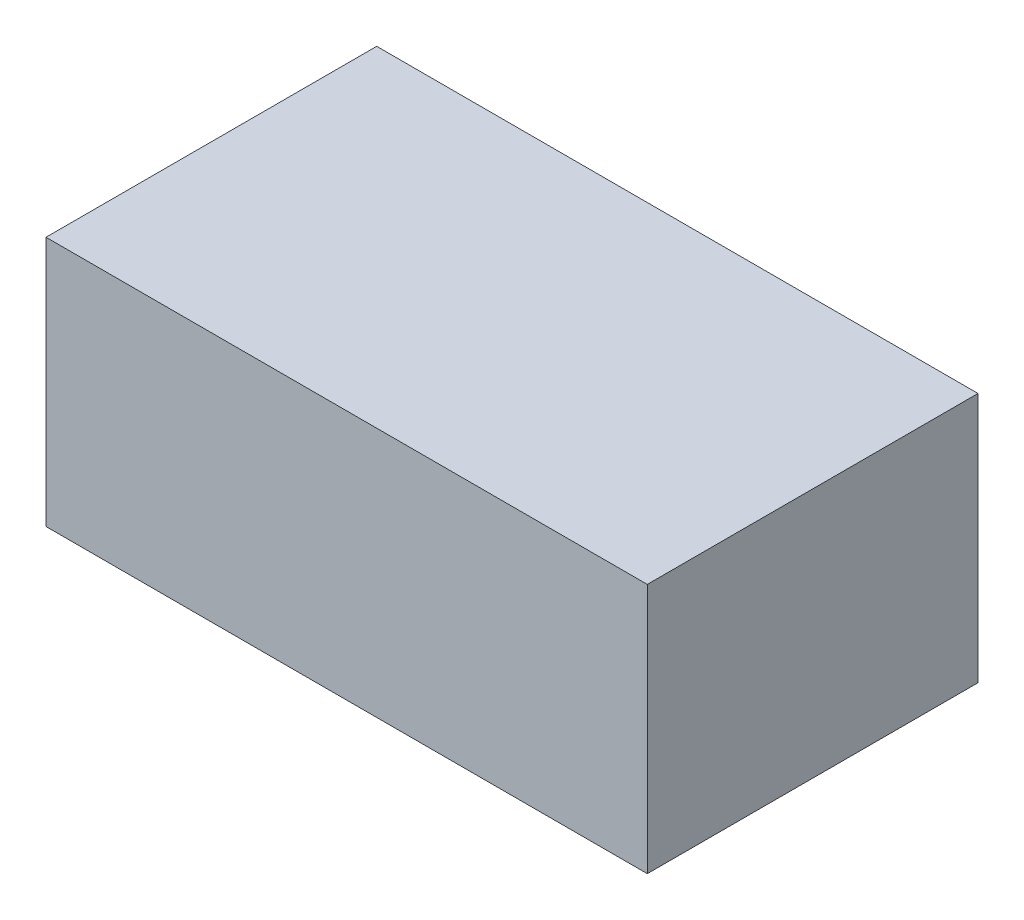
ISO-10303-21;
HEADER;
FILE_DESCRIPTION(('STEP AP214'),'2;1');
FILE_NAME('part.step','',(''),(''),'','','');
FILE_SCHEMA(('AUTOMOTIVE_DESIGN { 1 0 10303 214 1 1 1 1 }'));
ENDSEC;
DATA;
#1=APPLICATION_CONTEXT('core data for automotive mechanical design processes');
#2=APPLICATION_PROTOCOL_DEFINITION('international standard','automotive_design',2000,#1);
#3=PRODUCT_CONTEXT('',#1,'mechanical');
#4=PRODUCT('Part','Part','',(#3));
#5=PRODUCT_RELATED_PRODUCT_CATEGORY('part','',(#4));
#6=PRODUCT_DEFINITION_FORMATION('','',#4);
#7=PRODUCT_DEFINITION_CONTEXT('part definition',#1,'design');
#8=PRODUCT_DEFINITION('design','',#6,#7);
#9=PRODUCT_DEFINITION_SHAPE('','',#8);
#10=(LENGTH_UNIT() NAMED_UNIT(*) SI_UNIT(.MILLI.,.METRE.));
#11=(NAMED_UNIT(*) PLANE_ANGLE_UNIT() SI_UNIT($,.RADIAN.));
#12=(NAMED_UNIT(*) SI_UNIT($,.STERADIAN.) SOLID_ANGLE_UNIT());
#13=UNCERTAINTY_MEASURE_WITH_UNIT(LENGTH_MEASURE(1.E-05),#10,'distance_accuracy_value','');
#14=(GEOMETRIC_REPRESENTATION_CONTEXT(3) GLOBAL_UNCERTAINTY_ASSIGNED_CONTEXT((#13)) GLOBAL_UNIT_ASSIGNED_CONTEXT((#10,
#11,#12)) REPRESENTATION_CONTEXT('',''));
#15=CARTESIAN_POINT('',(0.,0.,0.));
#16=DIRECTION('',(0.,0.,1.));
#17=DIRECTION('',(1.,0.,0.));
#18=AXIS2_PLACEMENT_3D('',#15,#16,#17);
#19=CARTESIAN_POINT('',(-0.2999994,-0.12499848,0.32999934));
#20=DIRECTION('',(0.,0.,-1.));
#21=DIRECTION('',(0.,-1.,0.));
#22=AXIS2_PLACEMENT_3D('',#19,#20,#21);
#23=PLANE('',#22);
#24=DIRECTION('',(1.,0.,0.));
#25=VECTOR('',#24,1.);
#26=CARTESIAN_POINT('',(-0.2999994,-0.12499848,0.32999934));
#27=LINE('',#26,#25);
#28=CARTESIAN_POINT('',(-0.2999994,-0.12499848,0.32999934));
#29=VERTEX_POINT('',#28);
#30=CARTESIAN_POINT('',(0.2999994,-0.12499848,0.32999934));
#31=VERTEX_POINT('',#30);
#32=EDGE_CURVE('E89',#29,#31,#27,.T.);
#33=ORIENTED_EDGE('',*,*,#32,.T.);
#34=DIRECTION('',(0.,1.,0.));
#35=VECTOR('',#34,1.);
#36=CARTESIAN_POINT('',(0.2999994,-0.12499848,0.32999934));
#37=LINE('',#36,#35);
#38=CARTESIAN_POINT('',(0.2999994,0.12500102,0.32999934));
#39=VERTEX_POINT('',#38);
#40=EDGE_CURVE('E60',#31,#39,#37,.T.);
#41=ORIENTED_EDGE('',*,*,#40,.T.);
#42=DIRECTION('',(-1.,0.,0.));
#43=VECTOR('',#42,1.);
#44=CARTESIAN_POINT('',(0.2999994,0.12500102,0.32999934));
#45=LINE('',#44,#43);
#46=CARTESIAN_POINT('',(-0.2999994,0.12500102,0.32999934));
#47=VERTEX_POINT('',#46);
#48=EDGE_CURVE('E81',#39,#47,#45,.T.);
#49=ORIENTED_EDGE('',*,*,#48,.T.);
#50=DIRECTION('',(0.,-1.,0.));
#51=VECTOR('',#50,1.);
#52=CARTESIAN_POINT('',(-0.2999994,0.12500102,0.32999934));
#53=LINE('',#52,#51);
#54=EDGE_CURVE('E11',#47,#29,#53,.T.);
#55=ORIENTED_EDGE('',*,*,#54,.T.);
#56=EDGE_LOOP('',(#33,#41,#49,#55));
#57=FACE_BOUND('',#56,.T.);
#58=ADVANCED_FACE('F16',(#57),#23,.F.);
#59=CARTESIAN_POINT('',(-0.2999994,-0.12499848,0.));
#60=DIRECTION('',(0.,0.,-1.));
#61=DIRECTION('',(0.,-1.,0.));
#62=AXIS2_PLACEMENT_3D('',#59,#60,#61);
#63=PLANE('',#62);
#64=DIRECTION('',(0.,-1.,0.));
#65=VECTOR('',#64,1.);
#66=CARTESIAN_POINT('',(-0.2999994,0.12500102,0.));
#67=LINE('',#66,#65);
#68=CARTESIAN_POINT('',(-0.2999994,0.12500102,0.));
#69=VERTEX_POINT('',#68);
#70=CARTESIAN_POINT('',(-0.2999994,-0.12499848,0.));
#71=VERTEX_POINT('',#70);
#72=EDGE_CURVE('E27',#69,#71,#67,.T.);
#73=ORIENTED_EDGE('',*,*,#72,.F.);
#74=DIRECTION('',(-1.,0.,0.));
#75=VECTOR('',#74,1.);
#76=CARTESIAN_POINT('',(0.2999994,0.12500102,0.));
#77=LINE('',#76,#75);
#78=CARTESIAN_POINT('',(0.2999994,0.12500102,0.));
#79=VERTEX_POINT('',#78);
#80=EDGE_CURVE('E20',#79,#69,#77,.T.);
#81=ORIENTED_EDGE('',*,*,#80,.F.);
#82=DIRECTION('',(0.,1.,0.));
#83=VECTOR('',#82,1.);
#84=CARTESIAN_POINT('',(0.2999994,-0.12499848,0.));
#85=LINE('',#84,#83);
#86=CARTESIAN_POINT('',(0.2999994,-0.12499848,0.));
#87=VERTEX_POINT('',#86);
#88=EDGE_CURVE('E70',#87,#79,#85,.T.);
#89=ORIENTED_EDGE('',*,*,#88,.F.);
#90=DIRECTION('',(1.,0.,0.));
#91=VECTOR('',#90,1.);
#92=CARTESIAN_POINT('',(-0.2999994,-0.12499848,0.));
#93=LINE('',#92,#91);
#94=EDGE_CURVE('E113',#71,#87,#93,.T.);
#95=ORIENTED_EDGE('',*,*,#94,.F.);
#96=EDGE_LOOP('',(#73,#81,#89,#95));
#97=FACE_BOUND('',#96,.T.);
#98=ADVANCED_FACE('F115',(#97),#63,.T.);
#99=CARTESIAN_POINT('',(-0.2999994,0.12500102,0.));
#100=DIRECTION('',(1.,0.,0.));
#101=DIRECTION('',(0.,1.,0.));
#102=AXIS2_PLACEMENT_3D('',#99,#100,#101);
#103=PLANE('',#102);
#104=ORIENTED_EDGE('',*,*,#72,.T.);
#105=DIRECTION('',(0.,0.,1.));
#106=VECTOR('',#105,1.);
#107=CARTESIAN_POINT('',(-0.2999994,-0.12499848,0.));
#108=LINE('',#107,#106);
#109=EDGE_CURVE('E99',#71,#29,#108,.T.);
#110=ORIENTED_EDGE('',*,*,#109,.T.);
#111=ORIENTED_EDGE('',*,*,#54,.F.);
#112=DIRECTION('',(0.,0.,1.));
#113=VECTOR('',#112,1.);
#114=CARTESIAN_POINT('',(-0.2999994,0.12500102,0.));
#115=LINE('',#114,#113);
#116=EDGE_CURVE('E84',#69,#47,#115,.T.);
#117=ORIENTED_EDGE('',*,*,#116,.F.);
#118=EDGE_LOOP('',(#104,#110,#111,#117));
#119=FACE_BOUND('',#118,.T.);
#120=ADVANCED_FACE('F110',(#119),#103,.F.);
#121=CARTESIAN_POINT('',(0.2999994,0.12500102,0.));
#122=DIRECTION('',(0.,-1.,0.));
#123=DIRECTION('',(0.,0.,-1.));
#124=AXIS2_PLACEMENT_3D('',#121,#122,#123);
#125=PLANE('',#124);
#126=ORIENTED_EDGE('',*,*,#80,.T.);
#127=ORIENTED_EDGE('',*,*,#116,.T.);
#128=ORIENTED_EDGE('',*,*,#48,.F.);
#129=DIRECTION('',(0.,0.,1.));
#130=VECTOR('',#129,1.);
#131=CARTESIAN_POINT('',(0.2999994,0.12500102,0.));
#132=LINE('',#131,#130);
#133=EDGE_CURVE('E83',#79,#39,#132,.T.);
#134=ORIENTED_EDGE('',*,*,#133,.F.);
#135=EDGE_LOOP('',(#126,#127,#128,#134));
#136=FACE_BOUND('',#135,.T.);
#137=ADVANCED_FACE('F82',(#136),#125,.F.);
#138=CARTESIAN_POINT('',(0.2999994,-0.12499848,0.));
#139=DIRECTION('',(-1.,0.,0.));
#140=DIRECTION('',(0.,0.,1.));
#141=AXIS2_PLACEMENT_3D('',#138,#139,#140);
#142=PLANE('',#141);
#143=ORIENTED_EDGE('',*,*,#88,.T.);
#144=ORIENTED_EDGE('',*,*,#133,.T.);
#145=ORIENTED_EDGE('',*,*,#40,.F.);
#146=DIRECTION('',(0.,0.,1.));
#147=VECTOR('',#146,1.);
#148=CARTESIAN_POINT('',(0.2999994,-0.12499848,0.));
#149=LINE('',#148,#147);
#150=EDGE_CURVE('E105',#87,#31,#149,.T.);
#151=ORIENTED_EDGE('',*,*,#150,.F.);
#152=EDGE_LOOP('',(#143,#144,#145,#151));
#153=FACE_BOUND('',#152,.T.);
#154=ADVANCED_FACE('F92',(#153),#142,.F.);
#155=CARTESIAN_POINT('',(-0.2999994,-0.12499848,0.));
#156=DIRECTION('',(0.,1.,0.));
#157=DIRECTION('',(1.,0.,0.));
#158=AXIS2_PLACEMENT_3D('',#155,#156,#157);
#159=PLANE('',#158);
#160=ORIENTED_EDGE('',*,*,#94,.T.);
#161=ORIENTED_EDGE('',*,*,#150,.T.);
#162=ORIENTED_EDGE('',*,*,#32,.F.);
#163=ORIENTED_EDGE('',*,*,#109,.F.);
#164=EDGE_LOOP('',(#160,#161,#162,#163));
#165=FACE_BOUND('',#164,.T.);
#166=ADVANCED_FACE('F18',(#165),#159,.F.);
#167=CLOSED_SHELL('',(#58,#98,#120,#137,#154,#166));
#168=MANIFOLD_SOLID_BREP('B1',#167);
#169=ADVANCED_BREP_SHAPE_REPRESENTATION('',(#18,#168),#14);
#170=SHAPE_DEFINITION_REPRESENTATION(#9,#169);
ENDSEC;
END-ISO-10303-21;
